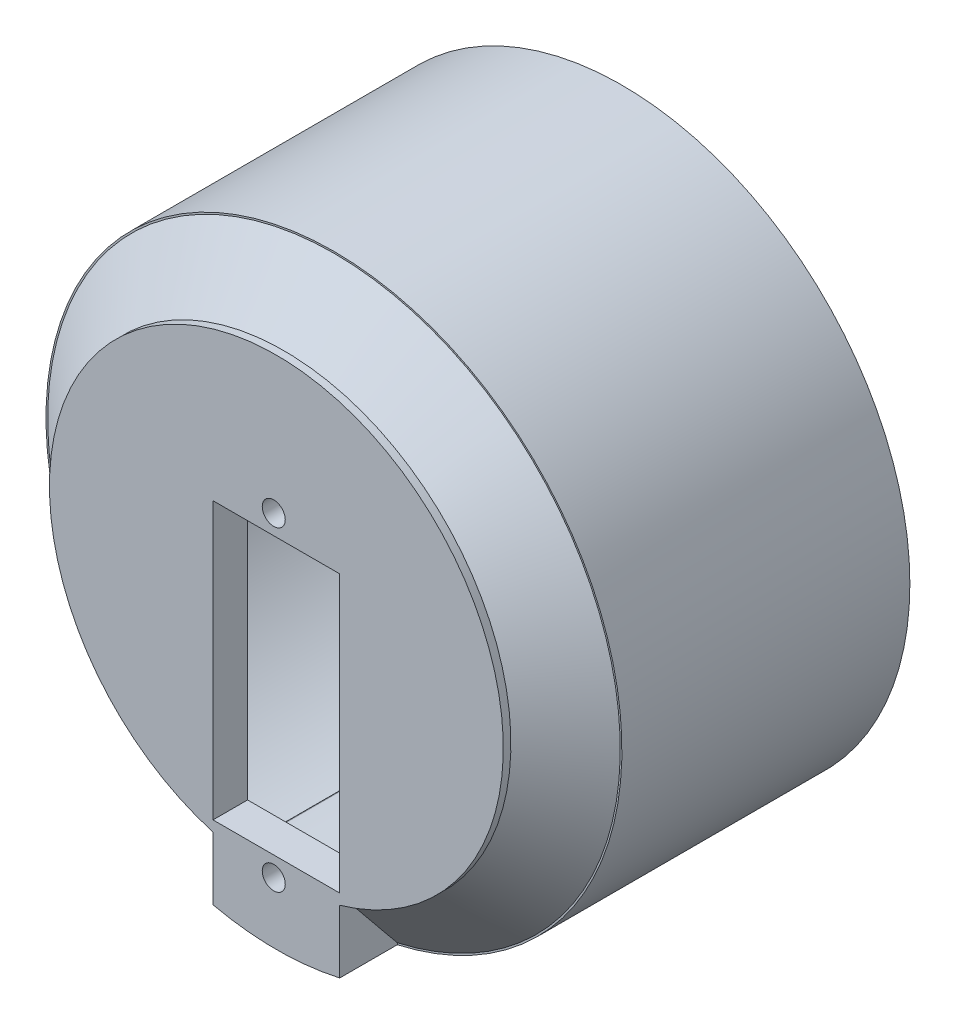
ISO-10303-21;
HEADER;
FILE_DESCRIPTION(('STEP AP214'),'2;1');
FILE_NAME('part.step','',(''),(''),'','','');
FILE_SCHEMA(('AUTOMOTIVE_DESIGN { 1 0 10303 214 1 1 1 1 }'));
ENDSEC;
DATA;
#1=APPLICATION_CONTEXT('core data for automotive mechanical design processes');
#2=APPLICATION_PROTOCOL_DEFINITION('international standard','automotive_design',2000,#1);
#3=PRODUCT_CONTEXT('',#1,'mechanical');
#4=PRODUCT('Part','Part','',(#3));
#5=PRODUCT_RELATED_PRODUCT_CATEGORY('part','',(#4));
#6=PRODUCT_DEFINITION_FORMATION('','',#4);
#7=PRODUCT_DEFINITION_CONTEXT('part definition',#1,'design');
#8=PRODUCT_DEFINITION('design','',#6,#7);
#9=PRODUCT_DEFINITION_SHAPE('','',#8);
#10=(LENGTH_UNIT() NAMED_UNIT(*) SI_UNIT(.MILLI.,.METRE.));
#11=(NAMED_UNIT(*) PLANE_ANGLE_UNIT() SI_UNIT($,.RADIAN.));
#12=(NAMED_UNIT(*) SI_UNIT($,.STERADIAN.) SOLID_ANGLE_UNIT());
#13=UNCERTAINTY_MEASURE_WITH_UNIT(LENGTH_MEASURE(1.E-05),#10,'distance_accuracy_value','');
#14=(GEOMETRIC_REPRESENTATION_CONTEXT(3) GLOBAL_UNCERTAINTY_ASSIGNED_CONTEXT((#13)) GLOBAL_UNIT_ASSIGNED_CONTEXT((#10,
#11,#12)) REPRESENTATION_CONTEXT('',''));
#15=CARTESIAN_POINT('',(0.,0.,0.));
#16=DIRECTION('',(0.,0.,1.));
#17=DIRECTION('',(1.,0.,0.));
#18=AXIS2_PLACEMENT_3D('',#15,#16,#17);
#19=CARTESIAN_POINT('',(0.,0.,25.));
#20=DIRECTION('',(0.,0.,-1.));
#21=DIRECTION('',(-1.,0.,0.));
#22=AXIS2_PLACEMENT_3D('',#19,#20,#21);
#23=CYLINDRICAL_SURFACE('',#22,22.);
#24=DIRECTION('',(0.,0.,1.));
#25=VECTOR('',#24,1.);
#26=CARTESIAN_POINT('',(5.44008097995109,-21.3167896018977,18.));
#27=LINE('',#26,#25);
#28=CARTESIAN_POINT('',(5.44008097995109,-21.3167896018977,18.));
#29=VERTEX_POINT('',#28);
#30=CARTESIAN_POINT('',(5.44008097995109,-21.3167896018977,27.));
#31=VERTEX_POINT('',#30);
#32=EDGE_CURVE('E224',#29,#31,#27,.T.);
#33=ORIENTED_EDGE('',*,*,#32,.F.);
#34=CARTESIAN_POINT('',(0.,0.,18.));
#35=DIRECTION('',(0.,0.,-1.));
#36=DIRECTION('',(-1.,0.,0.));
#37=AXIS2_PLACEMENT_3D('',#34,#35,#36);
#38=CIRCLE('',#37,22.);
#39=CARTESIAN_POINT('',(5.50000000000001,-21.3014084041408,18.));
#40=VERTEX_POINT('',#39);
#41=EDGE_CURVE('E76',#29,#40,#38,.F.);
#42=ORIENTED_EDGE('',*,*,#41,.T.);
#43=DIRECTION('',(0.,0.,-1.));
#44=VECTOR('',#43,1.);
#45=CARTESIAN_POINT('',(5.50000000000001,-21.3014084041408,25.));
#46=LINE('',#45,#44);
#47=CARTESIAN_POINT('',(5.50000000000001,-21.3014084041408,24.9874098905827));
#48=VERTEX_POINT('',#47);
#49=EDGE_CURVE('E269',#48,#40,#46,.T.);
#50=ORIENTED_EDGE('',*,*,#49,.F.);
#51=CARTESIAN_POINT('',(0.,0.,24.9874098905827));
#52=DIRECTION('',(0.,0.,-1.));
#53=DIRECTION('',(-1.,0.,0.));
#54=AXIS2_PLACEMENT_3D('',#51,#52,#53);
#55=CIRCLE('',#54,22.);
#56=CARTESIAN_POINT('',(-5.5,-21.3014084041408,24.9874098905827));
#57=VERTEX_POINT('',#56);
#58=EDGE_CURVE('E558',#57,#48,#55,.T.);
#59=ORIENTED_EDGE('',*,*,#58,.F.);
#60=DIRECTION('',(0.,0.,-1.));
#61=VECTOR('',#60,1.);
#62=CARTESIAN_POINT('',(-5.5,-21.3014084041408,25.));
#63=LINE('',#62,#61);
#64=CARTESIAN_POINT('',(-5.5,-21.3014084041408,18.));
#65=VERTEX_POINT('',#64);
#66=EDGE_CURVE('E259',#65,#57,#63,.F.);
#67=ORIENTED_EDGE('',*,*,#66,.F.);
#68=CARTESIAN_POINT('',(-5.44008097995109,-21.3167896018977,18.));
#69=VERTEX_POINT('',#68);
#70=EDGE_CURVE('E13',#65,#69,#38,.F.);
#71=ORIENTED_EDGE('',*,*,#70,.T.);
#72=DIRECTION('',(0.,0.,1.));
#73=VECTOR('',#72,1.);
#74=CARTESIAN_POINT('',(-5.44008097995109,-21.3167896018977,18.));
#75=LINE('',#74,#73);
#76=CARTESIAN_POINT('',(-5.44008097995109,-21.3167896018977,27.));
#77=VERTEX_POINT('',#76);
#78=EDGE_CURVE('E234',#69,#77,#75,.T.);
#79=ORIENTED_EDGE('',*,*,#78,.T.);
#80=CARTESIAN_POINT('',(0.,0.,27.));
#81=DIRECTION('',(0.,0.,-1.));
#82=DIRECTION('',(-1.,0.,0.));
#83=AXIS2_PLACEMENT_3D('',#80,#81,#82);
#84=CIRCLE('',#83,22.);
#85=EDGE_CURVE('E229',#31,#77,#84,.T.);
#86=ORIENTED_EDGE('',*,*,#85,.F.);
#87=EDGE_LOOP('',(#33,#42,#50,#59,#67,#71,#79,#86));
#88=FACE_BOUND('',#87,.T.);
#89=CARTESIAN_POINT('',(0.,0.,0.));
#90=DIRECTION('',(0.,0.,-1.));
#91=DIRECTION('',(-1.,0.,0.));
#92=AXIS2_PLACEMENT_3D('',#89,#90,#91);
#93=CIRCLE('',#92,22.);
#94=CARTESIAN_POINT('',(-22.,0.,0.));
#95=VERTEX_POINT('',#94);
#96=EDGE_CURVE('E466',#95,#95,#93,.T.);
#97=ORIENTED_EDGE('',*,*,#96,.T.);
#98=EDGE_LOOP('',(#97));
#99=FACE_BOUND('',#98,.T.);
#100=ADVANCED_FACE('F68',(#88,#99),#23,.F.);
#101=CARTESIAN_POINT('',(0.,0.,24.8786363184027));
#102=DIRECTION('',(0.,0.,-1.));
#103=DIRECTION('',(-1.,0.,0.));
#104=AXIS2_PLACEMENT_3D('',#101,#102,#103);
#105=CONICAL_SURFACE('',#104,25.,1.53455434546329);
#106=CARTESIAN_POINT('',(5.50000000000001,-14.6829865029652,25.2165853412473));
#107=CARTESIAN_POINT('',(5.50000000000001,-15.5122461025592,25.1884144601365));
#108=CARTESIAN_POINT('',(5.50000000000001,-16.3414966850203,25.1599803372252));
#109=CARTESIAN_POINT('',(5.50000000000001,-17.9999842225652,25.1027199385829));
#110=CARTESIAN_POINT('',(5.50000000000001,-18.8292211776506,25.0738936628984));
#111=CARTESIAN_POINT('',(5.50000000000001,-20.4876860034293,25.0159832848613));
#112=CARTESIAN_POINT('',(5.50000000000001,-21.3169138741232,24.9868991825277));
#113=CARTESIAN_POINT('',(5.50000000000001,-22.9753629471251,24.9285386726283));
#114=CARTESIAN_POINT('',(5.50000000000001,-23.8045841494322,24.8992622650403));
#115=CARTESIAN_POINT('',(5.50000000000001,-24.6338030989325,24.8699224699717));
#116=B_SPLINE_CURVE_WITH_KNOTS('',3,(#106,#107,#108,#109,#110,#111,#112,#113,#114,#115),
.UNSPECIFIED.,.F.,.F.,(4,2,2,2,4),(0.,2.48921373231164,4.97842716888889,7.46764042252315,
9.95685396476811),.UNSPECIFIED.);
#117=CARTESIAN_POINT('',(5.50000000000001,-20.9425905276891,25.));
#118=VERTEX_POINT('',#117);
#119=EDGE_CURVE('E261',#118,#48,#116,.T.);
#120=ORIENTED_EDGE('',*,*,#119,.F.);
#121=CARTESIAN_POINT('',(0.,0.,25.));
#122=DIRECTION('',(0.,0.,-1.));
#123=DIRECTION('',(-1.,0.,0.));
#124=AXIS2_PLACEMENT_3D('',#121,#122,#123);
#125=CIRCLE('',#124,21.6527619025946);
#126=CARTESIAN_POINT('',(-5.5,-20.9425905276891,25.));
#127=VERTEX_POINT('',#126);
#128=EDGE_CURVE('E340',#127,#118,#125,.T.);
#129=ORIENTED_EDGE('',*,*,#128,.F.);
#130=CARTESIAN_POINT('',(-5.5,-9.37859623119025,25.3908745161078));
#131=CARTESIAN_POINT('',(-5.5,-9.8315402006412,25.376701047878));
#132=CARTESIAN_POINT('',(-5.5,-10.2844763140847,25.3622800740103));
#133=CARTESIAN_POINT('',(-5.5,-11.1903359208793,25.3330504571022));
#134=CARTESIAN_POINT('',(-5.5,-11.6432594142339,25.3182418141699));
#135=CARTESIAN_POINT('',(-5.5,-13.0020153878447,25.2733954023074));
#136=CARTESIAN_POINT('',(-5.5,-13.9078339546625,25.2429371314737));
#137=CARTESIAN_POINT('',(-5.5,-15.7194476027846,25.1813562763794));
#138=CARTESIAN_POINT('',(-5.5,-16.6252426841087,25.1502336926945));
#139=CARTESIAN_POINT('',(-5.5,-18.4368182333387,25.0875613154027));
#140=CARTESIAN_POINT('',(-5.5,-19.3425987012416,25.0560115217099));
#141=CARTESIAN_POINT('',(-5.5,-21.2952993652556,24.9876863874938));
#142=CARTESIAN_POINT('',(-5.5,-22.3422178740088,24.9508628874686));
#143=CARTESIAN_POINT('',(-5.5,-24.4360458836645,24.8769603552005));
#144=CARTESIAN_POINT('',(-5.5,-25.4829553845667,24.8398813229528));
#145=CARTESIAN_POINT('',(-5.5,-27.5767689385705,24.7655450794539));
#146=CARTESIAN_POINT('',(-5.5,-28.6236729916667,24.7282878680527));
#147=CARTESIAN_POINT('',(-5.5,-30.7174763259439,24.6536409963876));
#148=CARTESIAN_POINT('',(-5.5,-31.7643756071253,24.6162513361301));
#149=CARTESIAN_POINT('',(-5.5,-32.8112733315299,24.578818299217));
#150=B_SPLINE_CURVE_WITH_KNOTS('',3,(#130,#131,#132,#133,#134,#135,#136,#137,#138,#139,#140,
#141,#142,#143,#144,#145,#146,#147,#148,#149),.UNSPECIFIED.,.F.,.F.,(4,2,2,2,2,2,2,2,2,4),(0.,
1.35949678857996,2.71899319817734,5.43798423743233,8.15697291992263,10.8759621482772,
14.0186598307858,17.1613575713456,20.3040579559416,23.446758187929),.UNSPECIFIED.);
#151=EDGE_CURVE('E323',#127,#57,#150,.T.);
#152=ORIENTED_EDGE('',*,*,#151,.T.);
#153=ORIENTED_EDGE('',*,*,#58,.T.);
#154=EDGE_LOOP('',(#120,#129,#152,#153));
#155=FACE_BOUND('',#154,.T.);
#156=ADVANCED_FACE('F271',(#155),#105,.F.);
#157=CARTESIAN_POINT('',(0.,0.,25.));
#158=DIRECTION('',(0.,0.,1.));
#159=DIRECTION('',(1.,0.,0.));
#160=AXIS2_PLACEMENT_3D('',#157,#158,#159);
#161=CYLINDRICAL_SURFACE('',#160,19.701313303964);
#162=DIRECTION('',(0.,0.,-1.));
#163=VECTOR('',#162,1.);
#164=CARTESIAN_POINT('',(-9.06144932155645,-17.4937669497971,27.));
#165=LINE('',#164,#163);
#166=CARTESIAN_POINT('',(-9.06144932155645,-17.4937669497971,27.));
#167=VERTEX_POINT('',#166);
#168=CARTESIAN_POINT('',(-9.06144932155645,-17.4937669497971,25.));
#169=VERTEX_POINT('',#168);
#170=EDGE_CURVE('E332',#167,#169,#165,.T.);
#171=ORIENTED_EDGE('',*,*,#170,.F.);
#172=CARTESIAN_POINT('',(0.,0.,27.));
#173=DIRECTION('',(0.,0.,-1.));
#174=DIRECTION('',(-1.,0.,0.));
#175=AXIS2_PLACEMENT_3D('',#172,#173,#174);
#176=CIRCLE('',#175,19.701313303964);
#177=CARTESIAN_POINT('',(-5.5,-18.9180270086748,27.));
#178=VERTEX_POINT('',#177);
#179=EDGE_CURVE('E384',#178,#167,#176,.T.);
#180=ORIENTED_EDGE('',*,*,#179,.F.);
#181=DIRECTION('',(0.,0.,1.));
#182=VECTOR('',#181,1.);
#183=CARTESIAN_POINT('',(-5.5,-18.9180270086748,25.));
#184=LINE('',#183,#182);
#185=CARTESIAN_POINT('',(-5.5,-18.9180270086748,28.5678935515272));
#186=VERTEX_POINT('',#185);
#187=EDGE_CURVE('E470',#178,#186,#184,.T.);
#188=ORIENTED_EDGE('',*,*,#187,.T.);
#189=CARTESIAN_POINT('',(0.,0.,28.5678935515272));
#190=DIRECTION('',(0.,0.,-1.));
#191=DIRECTION('',(-1.,0.,0.));
#192=AXIS2_PLACEMENT_3D('',#189,#190,#191);
#193=CIRCLE('',#192,19.701313303964);
#194=CARTESIAN_POINT('',(5.5,-18.9180270086748,28.5678935515272));
#195=VERTEX_POINT('',#194);
#196=EDGE_CURVE('E574',#186,#195,#193,.T.);
#197=ORIENTED_EDGE('',*,*,#196,.T.);
#198=DIRECTION('',(0.,0.,1.));
#199=VECTOR('',#198,1.);
#200=CARTESIAN_POINT('',(5.5,-18.9180270086748,25.));
#201=LINE('',#200,#199);
#202=CARTESIAN_POINT('',(5.5,-18.9180270086748,27.));
#203=VERTEX_POINT('',#202);
#204=EDGE_CURVE('E477',#203,#195,#201,.T.);
#205=ORIENTED_EDGE('',*,*,#204,.F.);
#206=CARTESIAN_POINT('',(9.06144932155645,-17.4937669497971,27.));
#207=VERTEX_POINT('',#206);
#208=EDGE_CURVE('E379',#207,#203,#176,.T.);
#209=ORIENTED_EDGE('',*,*,#208,.F.);
#210=DIRECTION('',(0.,0.,-1.));
#211=VECTOR('',#210,1.);
#212=CARTESIAN_POINT('',(9.06144932155645,-17.4937669497971,27.));
#213=LINE('',#212,#211);
#214=CARTESIAN_POINT('',(9.06144932155645,-17.4937669497971,25.));
#215=VERTEX_POINT('',#214);
#216=EDGE_CURVE('E342',#207,#215,#213,.T.);
#217=ORIENTED_EDGE('',*,*,#216,.T.);
#218=CARTESIAN_POINT('',(0.,0.,25.));
#219=DIRECTION('',(0.,0.,1.));
#220=DIRECTION('',(1.,0.,0.));
#221=AXIS2_PLACEMENT_3D('',#218,#219,#220);
#222=CIRCLE('',#221,19.701313303964);
#223=EDGE_CURVE('E453',#215,#169,#222,.T.);
#224=ORIENTED_EDGE('',*,*,#223,.T.);
#225=EDGE_LOOP('',(#171,#180,#188,#197,#205,#209,#217,#224));
#226=FACE_BOUND('',#225,.T.);
#227=ADVANCED_FACE('F530',(#226),#161,.T.);
#228=CARTESIAN_POINT('',(-5.5,0.,25.));
#229=DIRECTION('',(-1.,0.,0.));
#230=DIRECTION('',(0.,0.,1.));
#231=AXIS2_PLACEMENT_3D('',#228,#229,#230);
#232=PLANE('',#231);
#233=ORIENTED_EDGE('',*,*,#187,.F.);
#234=DIRECTION('',(0.,1.,0.));
#235=VECTOR('',#234,1.);
#236=CARTESIAN_POINT('',(-5.5,0.,27.));
#237=LINE('',#236,#235);
#238=CARTESIAN_POINT('',(-5.5,-19.809519206206,27.));
#239=VERTEX_POINT('',#238);
#240=EDGE_CURVE('E389',#239,#178,#237,.T.);
#241=ORIENTED_EDGE('',*,*,#240,.F.);
#242=CARTESIAN_POINT('',(-5.5,-14.2260768253443,36.7022450638078));
#243=CARTESIAN_POINT('',(-5.5,-14.4493178306684,36.3215406891056));
#244=CARTESIAN_POINT('',(-5.5,-14.672056617973,35.9405423025907));
#245=CARTESIAN_POINT('',(-5.5,-15.1166408997499,35.1780253386219));
#246=CARTESIAN_POINT('',(-5.5,-15.3384863954471,34.7965067618824));
#247=CARTESIAN_POINT('',(-5.5,-16.0028479100555,33.6512755223987));
#248=CARTESIAN_POINT('',(-5.5,-16.4441916411825,32.8868827658367));
#249=CARTESIAN_POINT('',(-5.5,-17.3244052833301,31.3566967639084));
#250=CARTESIAN_POINT('',(-5.5,-17.7632752460372,30.5909035482492));
#251=CARTESIAN_POINT('',(-5.5,-18.6390287715927,29.0581808524109));
#252=CARTESIAN_POINT('',(-5.5,-19.075912331013,28.2912513702739));
#253=CARTESIAN_POINT('',(-5.5,-20.3841372517835,25.9891171502764));
#254=CARTESIAN_POINT('',(-5.5,-21.2530670014334,24.452541986987));
#255=CARTESIAN_POINT('',(-5.5,-22.5531417802179,22.1457896967271));
#256=CARTESIAN_POINT('',(-5.5,-22.9859513506115,21.3765490923014));
#257=CARTESIAN_POINT('',(-5.5,-23.8506161101238,19.8375319614718));
#258=CARTESIAN_POINT('',(-5.5,-24.2824712995437,19.0677554352374));
#259=CARTESIAN_POINT('',(-5.5,-24.7139271232146,18.2977549361922));
#260=B_SPLINE_CURVE_WITH_KNOTS('',3,(#242,#243,#244,#245,#246,#247,#248,#249,#250,#251,#252,
#253,#254,#255,#256,#257,#258,#259),.UNSPECIFIED.,.F.,.F.,(4,2,2,2,2,2,2,2,4),(0.,
1.32398964579704,2.64797747528611,5.29593719603219,7.94384138404397,10.5917501399703,
15.8874823862485,18.5354052383518,21.1833272543564),.UNSPECIFIED.);
#261=EDGE_CURVE('E331',#186,#239,#260,.T.);
#262=ORIENTED_EDGE('',*,*,#261,.F.);
#263=EDGE_LOOP('',(#233,#241,#262));
#264=FACE_BOUND('',#263,.T.);
#265=ADVANCED_FACE('F538',(#264),#232,.T.);
#266=CARTESIAN_POINT('',(5.5,0.,25.));
#267=DIRECTION('',(-1.,0.,0.));
#268=DIRECTION('',(0.,-1.,0.));
#269=AXIS2_PLACEMENT_3D('',#266,#267,#268);
#270=PLANE('',#269);
#271=DIRECTION('',(0.,-1.,0.));
#272=VECTOR('',#271,1.);
#273=CARTESIAN_POINT('',(5.5,0.,27.));
#274=LINE('',#273,#272);
#275=CARTESIAN_POINT('',(5.5,-19.809519206206,27.));
#276=VERTEX_POINT('',#275);
#277=EDGE_CURVE('E386',#203,#276,#274,.T.);
#278=ORIENTED_EDGE('',*,*,#277,.F.);
#279=ORIENTED_EDGE('',*,*,#204,.T.);
#280=CARTESIAN_POINT('',(5.5,-24.1515932295979,19.3007847394464));
#281=CARTESIAN_POINT('',(5.5,-23.7669010261033,19.9865671448865));
#282=CARTESIAN_POINT('',(5.5,-23.3818688331949,20.6721586989083));
#283=CARTESIAN_POINT('',(5.5,-22.6110057064612,22.0428929100748));
#284=CARTESIAN_POINT('',(5.5,-22.2251747723497,22.7280355670586));
#285=CARTESIAN_POINT('',(5.5,-21.0663188895503,24.7826660396843));
#286=CARTESIAN_POINT('',(5.5,-20.2919181604128,26.1513790154122));
#287=CARTESIAN_POINT('',(5.5,-19.1264788377258,28.2022772298326));
#288=CARTESIAN_POINT('',(5.5,-18.7373571993935,28.8855518600639));
#289=CARTESIAN_POINT('',(5.5,-17.9575709966463,30.2512194113319));
#290=CARTESIAN_POINT('',(5.5,-17.5669064338984,30.9336123333202));
#291=CARTESIAN_POINT('',(5.5,-16.7837127674561,32.297342628982));
#292=CARTESIAN_POINT('',(5.5,-16.3911836340131,32.9786799855827));
#293=CARTESIAN_POINT('',(5.5,-15.6038097619982,34.3400184997517));
#294=CARTESIAN_POINT('',(5.5,-15.2089650146293,35.0200196522306));
#295=CARTESIAN_POINT('',(5.5,-14.8127353130996,35.6992152605535));
#296=B_SPLINE_CURVE_WITH_KNOTS('',3,(#280,#281,#282,#283,#284,#285,#286,#287,#288,#289,#290,
#291,#292,#293,#294,#295),.UNSPECIFIED.,.F.,.F.,(4,2,2,2,2,2,2,4),(0.,2.35893374962126,
4.71786834487805,9.43565961099211,11.794581295471,14.1535004319733,16.5124573314685,
18.8714231984059),.UNSPECIFIED.);
#297=EDGE_CURVE('E330',#276,#195,#296,.T.);
#298=ORIENTED_EDGE('',*,*,#297,.F.);
#299=EDGE_LOOP('',(#278,#279,#298));
#300=FACE_BOUND('',#299,.T.);
#301=ADVANCED_FACE('F542',(#300),#270,.F.);
#302=CARTESIAN_POINT('',(-5.5,6.,30.));
#303=DIRECTION('',(1.,0.,0.));
#304=DIRECTION('',(0.,1.,0.));
#305=AXIS2_PLACEMENT_3D('',#302,#303,#304);
#306=PLANE('',#305);
#307=DIRECTION('',(0.,0.,-1.));
#308=VECTOR('',#307,1.);
#309=CARTESIAN_POINT('',(-5.5,-18.,30.));
#310=LINE('',#309,#308);
#311=CARTESIAN_POINT('',(-5.5,-18.,30.));
#312=VERTEX_POINT('',#311);
#313=CARTESIAN_POINT('',(-5.5,-18.,27.));
#314=VERTEX_POINT('',#313);
#315=EDGE_CURVE('E421',#312,#314,#310,.T.);
#316=ORIENTED_EDGE('',*,*,#315,.T.);
#317=DIRECTION('',(0.,-1.,0.));
#318=VECTOR('',#317,1.);
#319=CARTESIAN_POINT('',(-5.5,0.,27.));
#320=LINE('',#319,#318);
#321=CARTESIAN_POINT('',(-5.5,6.,27.));
#322=VERTEX_POINT('',#321);
#323=EDGE_CURVE('E401',#322,#314,#320,.T.);
#324=ORIENTED_EDGE('',*,*,#323,.F.);
#325=DIRECTION('',(0.,0.,-1.));
#326=VECTOR('',#325,1.);
#327=CARTESIAN_POINT('',(-5.5,6.,30.));
#328=LINE('',#327,#326);
#329=CARTESIAN_POINT('',(-5.5,6.,30.));
#330=VERTEX_POINT('',#329);
#331=EDGE_CURVE('E425',#330,#322,#328,.T.);
#332=ORIENTED_EDGE('',*,*,#331,.F.);
#333=DIRECTION('',(0.,-1.,0.));
#334=VECTOR('',#333,1.);
#335=CARTESIAN_POINT('',(-5.5,6.,30.));
#336=LINE('',#335,#334);
#337=EDGE_CURVE('E484',#330,#312,#336,.T.);
#338=ORIENTED_EDGE('',*,*,#337,.T.);
#339=EDGE_LOOP('',(#316,#324,#332,#338));
#340=FACE_BOUND('',#339,.T.);
#341=ADVANCED_FACE('F497',(#340),#306,.T.);
#342=CARTESIAN_POINT('',(-5.5,-18.,30.));
#343=DIRECTION('',(0.,1.,0.));
#344=DIRECTION('',(0.,0.,1.));
#345=AXIS2_PLACEMENT_3D('',#342,#343,#344);
#346=PLANE('',#345);
#347=DIRECTION('',(0.,0.,-1.));
#348=VECTOR('',#347,1.);
#349=CARTESIAN_POINT('',(5.50000000000001,-18.,30.));
#350=LINE('',#349,#348);
#351=CARTESIAN_POINT('',(5.50000000000001,-18.,30.));
#352=VERTEX_POINT('',#351);
#353=CARTESIAN_POINT('',(5.50000000000001,-18.,27.));
#354=VERTEX_POINT('',#353);
#355=EDGE_CURVE('E415',#352,#354,#350,.T.);
#356=ORIENTED_EDGE('',*,*,#355,.T.);
#357=DIRECTION('',(1.,0.,0.));
#358=VECTOR('',#357,1.);
#359=CARTESIAN_POINT('',(0.,-18.,27.));
#360=LINE('',#359,#358);
#361=EDGE_CURVE('E403',#314,#354,#360,.T.);
#362=ORIENTED_EDGE('',*,*,#361,.F.);
#363=ORIENTED_EDGE('',*,*,#315,.F.);
#364=DIRECTION('',(1.,0.,0.));
#365=VECTOR('',#364,1.);
#366=CARTESIAN_POINT('',(-5.5,-18.,30.));
#367=LINE('',#366,#365);
#368=EDGE_CURVE('E420',#312,#352,#367,.T.);
#369=ORIENTED_EDGE('',*,*,#368,.T.);
#370=EDGE_LOOP('',(#356,#362,#363,#369));
#371=FACE_BOUND('',#370,.T.);
#372=ADVANCED_FACE('F418',(#371),#346,.T.);
#373=CARTESIAN_POINT('',(5.5,6.,30.));
#374=DIRECTION('',(-1.,0.,0.));
#375=DIRECTION('',(0.,-1.,0.));
#376=AXIS2_PLACEMENT_3D('',#373,#374,#375);
#377=PLANE('',#376);
#378=DIRECTION('',(0.,0.,-1.));
#379=VECTOR('',#378,1.);
#380=CARTESIAN_POINT('',(5.5,6.,30.));
#381=LINE('',#380,#379);
#382=CARTESIAN_POINT('',(5.5,6.,30.));
#383=VERTEX_POINT('',#382);
#384=CARTESIAN_POINT('',(5.5,6.,27.));
#385=VERTEX_POINT('',#384);
#386=EDGE_CURVE('E417',#383,#385,#381,.T.);
#387=ORIENTED_EDGE('',*,*,#386,.T.);
#388=DIRECTION('',(0.,1.,0.));
#389=VECTOR('',#388,1.);
#390=CARTESIAN_POINT('',(5.5,0.,27.));
#391=LINE('',#390,#389);
#392=EDGE_CURVE('E91',#354,#385,#391,.T.);
#393=ORIENTED_EDGE('',*,*,#392,.F.);
#394=ORIENTED_EDGE('',*,*,#355,.F.);
#395=DIRECTION('',(0.,1.,0.));
#396=VECTOR('',#395,1.);
#397=CARTESIAN_POINT('',(5.5,6.,30.));
#398=LINE('',#397,#396);
#399=EDGE_CURVE('E487',#352,#383,#398,.T.);
#400=ORIENTED_EDGE('',*,*,#399,.T.);
#401=EDGE_LOOP('',(#387,#393,#394,#400));
#402=FACE_BOUND('',#401,.T.);
#403=ADVANCED_FACE('F413',(#402),#377,.T.);
#404=CARTESIAN_POINT('',(-5.5,6.,30.));
#405=DIRECTION('',(0.,-1.,0.));
#406=DIRECTION('',(0.,0.,-1.));
#407=AXIS2_PLACEMENT_3D('',#404,#405,#406);
#408=PLANE('',#407);
#409=ORIENTED_EDGE('',*,*,#331,.T.);
#410=DIRECTION('',(-1.,0.,0.));
#411=VECTOR('',#410,1.);
#412=CARTESIAN_POINT('',(0.,6.,27.));
#413=LINE('',#412,#411);
#414=EDGE_CURVE('E365',#385,#322,#413,.T.);
#415=ORIENTED_EDGE('',*,*,#414,.F.);
#416=ORIENTED_EDGE('',*,*,#386,.F.);
#417=DIRECTION('',(-1.,0.,0.));
#418=VECTOR('',#417,1.);
#419=CARTESIAN_POINT('',(-5.5,6.,30.));
#420=LINE('',#419,#418);
#421=EDGE_CURVE('E489',#383,#330,#420,.T.);
#422=ORIENTED_EDGE('',*,*,#421,.T.);
#423=EDGE_LOOP('',(#409,#415,#416,#422));
#424=FACE_BOUND('',#423,.T.);
#425=ADVANCED_FACE('F493',(#424),#408,.T.);
#426=CARTESIAN_POINT('',(-0.227477253695701,7.7,30.));
#427=DIRECTION('',(0.,0.,-1.));
#428=DIRECTION('',(-1.,0.,0.));
#429=AXIS2_PLACEMENT_3D('',#426,#427,#428);
#430=CYLINDRICAL_SURFACE('',#429,1.);
#431=CARTESIAN_POINT('',(-0.227477253695701,7.7,30.));
#432=DIRECTION('',(0.,0.,1.));
#433=DIRECTION('',(1.,0.,0.));
#434=AXIS2_PLACEMENT_3D('',#431,#432,#433);
#435=CIRCLE('',#434,1.);
#436=CARTESIAN_POINT('',(0.772522746304299,7.7,30.));
#437=VERTEX_POINT('',#436);
#438=EDGE_CURVE('E481',#437,#437,#435,.T.);
#439=ORIENTED_EDGE('',*,*,#438,.T.);
#440=EDGE_LOOP('',(#439));
#441=FACE_BOUND('',#440,.T.);
#442=CARTESIAN_POINT('',(-0.227477253695701,7.7,27.));
#443=DIRECTION('',(0.,0.,-1.));
#444=DIRECTION('',(-1.,0.,0.));
#445=AXIS2_PLACEMENT_3D('',#442,#443,#444);
#446=CIRCLE('',#445,1.);
#447=CARTESIAN_POINT('',(-1.2274772536957,7.7,27.));
#448=VERTEX_POINT('',#447);
#449=EDGE_CURVE('E361',#448,#448,#446,.F.);
#450=ORIENTED_EDGE('',*,*,#449,.F.);
#451=EDGE_LOOP('',(#450));
#452=FACE_BOUND('',#451,.T.);
#453=ADVANCED_FACE('F595',(#441,#452),#430,.F.);
#454=CARTESIAN_POINT('',(-0.227477253695698,-19.7,30.));
#455=DIRECTION('',(0.,0.,-1.));
#456=DIRECTION('',(-1.,0.,0.));
#457=AXIS2_PLACEMENT_3D('',#454,#455,#456);
#458=CYLINDRICAL_SURFACE('',#457,1.);
#459=CARTESIAN_POINT('',(-0.227477253695698,-19.7,30.));
#460=DIRECTION('',(0.,0.,1.));
#461=DIRECTION('',(1.,0.,0.));
#462=AXIS2_PLACEMENT_3D('',#459,#460,#461);
#463=CIRCLE('',#462,1.);
#464=CARTESIAN_POINT('',(0.772522746304303,-19.7,30.));
#465=VERTEX_POINT('',#464);
#466=EDGE_CURVE('E472',#465,#465,#463,.T.);
#467=ORIENTED_EDGE('',*,*,#466,.T.);
#468=EDGE_LOOP('',(#467));
#469=FACE_BOUND('',#468,.T.);
#470=CARTESIAN_POINT('',(-0.227477253695698,-19.7,27.));
#471=DIRECTION('',(0.,0.,-1.));
#472=DIRECTION('',(-1.,0.,0.));
#473=AXIS2_PLACEMENT_3D('',#470,#471,#472);
#474=CIRCLE('',#473,1.);
#475=CARTESIAN_POINT('',(-1.2274772536957,-19.7,27.));
#476=VERTEX_POINT('',#475);
#477=EDGE_CURVE('E377',#476,#476,#474,.F.);
#478=ORIENTED_EDGE('',*,*,#477,.F.);
#479=EDGE_LOOP('',(#478));
#480=FACE_BOUND('',#479,.T.);
#481=ADVANCED_FACE('F590',(#469,#480),#458,.F.);
#482=CARTESIAN_POINT('',(0.,0.,25.));
#483=DIRECTION('',(0.,0.,-1.));
#484=DIRECTION('',(-1.,0.,0.));
#485=AXIS2_PLACEMENT_3D('',#482,#483,#484);
#486=PLANE('',#485);
#487=ORIENTED_EDGE('',*,*,#223,.F.);
#488=DIRECTION('',(0.,1.,0.));
#489=VECTOR('',#488,1.);
#490=CARTESIAN_POINT('',(9.06144932155645,0.,25.));
#491=LINE('',#490,#489);
#492=CARTESIAN_POINT('',(9.06144932155645,9.50721702610733,25.));
#493=VERTEX_POINT('',#492);
#494=EDGE_CURVE('E357',#215,#493,#491,.T.);
#495=ORIENTED_EDGE('',*,*,#494,.T.);
#496=DIRECTION('',(-1.,0.,0.));
#497=VECTOR('',#496,1.);
#498=CARTESIAN_POINT('',(0.,9.50721702610733,25.));
#499=LINE('',#498,#497);
#500=CARTESIAN_POINT('',(-9.06144932155645,9.50721702610733,25.));
#501=VERTEX_POINT('',#500);
#502=EDGE_CURVE('E373',#493,#501,#499,.T.);
#503=ORIENTED_EDGE('',*,*,#502,.T.);
#504=DIRECTION('',(0.,1.,0.));
#505=VECTOR('',#504,1.);
#506=CARTESIAN_POINT('',(-9.06144932155645,0.,25.));
#507=LINE('',#506,#505);
#508=EDGE_CURVE('E372',#169,#501,#507,.T.);
#509=ORIENTED_EDGE('',*,*,#508,.F.);
#510=EDGE_LOOP('',(#487,#495,#503,#509));
#511=FACE_BOUND('',#510,.T.);
#512=ADVANCED_FACE('F533',(#511),#486,.T.);
#513=CARTESIAN_POINT('',(5.5,-18.9180270086748,29.3404288393407));
#514=VERTEX_POINT('',#513);
#515=CARTESIAN_POINT('',(5.5,-18.9180270086748,30.));
#516=VERTEX_POINT('',#515);
#517=EDGE_CURVE('E461',#514,#516,#201,.T.);
#518=ORIENTED_EDGE('',*,*,#517,.F.);
#519=CARTESIAN_POINT('',(0.,0.,29.3404288393407));
#520=DIRECTION('',(0.,0.,-1.));
#521=DIRECTION('',(-1.,0.,0.));
#522=AXIS2_PLACEMENT_3D('',#519,#520,#521);
#523=CIRCLE('',#522,19.701313303964);
#524=CARTESIAN_POINT('',(-5.5,-18.9180270086748,29.3404288393407));
#525=VERTEX_POINT('',#524);
#526=EDGE_CURVE('E514',#514,#525,#523,.F.);
#527=ORIENTED_EDGE('',*,*,#526,.T.);
#528=CARTESIAN_POINT('',(-5.5,-18.9180270086748,30.));
#529=VERTEX_POINT('',#528);
#530=EDGE_CURVE('E473',#525,#529,#184,.T.);
#531=ORIENTED_EDGE('',*,*,#530,.T.);
#532=CARTESIAN_POINT('',(0.,0.,30.));
#533=DIRECTION('',(0.,0.,1.));
#534=DIRECTION('',(1.,0.,0.));
#535=AXIS2_PLACEMENT_3D('',#532,#533,#534);
#536=CIRCLE('',#535,19.701313303964);
#537=EDGE_CURVE('E462',#516,#529,#536,.T.);
#538=ORIENTED_EDGE('',*,*,#537,.F.);
#539=EDGE_LOOP('',(#518,#527,#531,#538));
#540=FACE_BOUND('',#539,.T.);
#541=ADVANCED_FACE('F511',(#540),#161,.T.);
#542=ORIENTED_EDGE('',*,*,#530,.F.);
#543=CARTESIAN_POINT('',(-5.5,-34.3397130176316,16.64553514238));
#544=CARTESIAN_POINT('',(-5.5,-33.7960056003316,17.097603935747));
#545=CARTESIAN_POINT('',(-5.5,-33.2521681632569,17.5495163297719));
#546=CARTESIAN_POINT('',(-5.5,-32.1641878750666,18.4529734597862));
#547=CARTESIAN_POINT('',(-5.5,-31.6200450239107,18.9045181957267));
#548=CARTESIAN_POINT('',(-5.5,-29.9871295092889,20.2584861054101));
#549=CARTESIAN_POINT('',(-5.5,-28.8978309294136,21.1602753838626));
#550=CARTESIAN_POINT('',(-5.5,-26.717539170032,22.9613138863923));
#551=CARTESIAN_POINT('',(-5.5,-25.6265464167496,23.8605636263148));
#552=CARTESIAN_POINT('',(-5.5,-23.4417584827982,25.6557406697232));
#553=CARTESIAN_POINT('',(-5.5,-22.3479631981773,26.5516678468606));
#554=CARTESIAN_POINT('',(-5.5,-20.7039317790233,27.8918654382025));
#555=CARTESIAN_POINT('',(-5.5,-20.1552662064901,28.3380621184797));
#556=CARTESIAN_POINT('',(-5.5,-19.0566074609594,29.2288132371445));
#557=CARTESIAN_POINT('',(-5.5,-18.506614294683,29.6733676838174));
#558=CARTESIAN_POINT('',(-5.5,-17.4049814289751,30.5603284138007));
#559=CARTESIAN_POINT('',(-5.5,-16.8533418866599,31.0027348921379));
#560=CARTESIAN_POINT('',(-5.5,-15.7478356033156,31.8847813079484));
#561=CARTESIAN_POINT('',(-5.5,-15.193968819861,32.3244211923093));
#562=CARTESIAN_POINT('',(-5.5,-14.0830759935893,33.2000901066982));
#563=CARTESIAN_POINT('',(-5.5,-13.5260489281309,33.6361178405971));
#564=CARTESIAN_POINT('',(-5.5,-12.4079407751966,34.502901266942));
#565=CARTESIAN_POINT('',(-5.5,-11.8468599038463,34.9336572371977));
#566=CARTESIAN_POINT('',(-5.5,-11.0007573286729,35.5740675046558));
#567=CARTESIAN_POINT('',(-5.5,-10.7179289317509,35.7866184579183));
#568=CARTESIAN_POINT('',(-5.5,-10.1504857395148,36.2093141404703));
#569=CARTESIAN_POINT('',(-5.5,-9.86587097676355,36.4194589134248));
#570=CARTESIAN_POINT('',(-5.5,-9.29439677246642,36.8367890442433));
#571=CARTESIAN_POINT('',(-5.5,-9.00753693943823,37.0439738673322));
#572=CARTESIAN_POINT('',(-5.5,-8.57519491615579,37.3518881075386));
#573=CARTESIAN_POINT('',(-5.5,-8.43073428070444,37.4540521944072));
#574=CARTESIAN_POINT('',(-5.5,-8.14104356947603,37.6572875653603));
#575=CARTESIAN_POINT('',(-5.5,-7.99581348296459,37.7583588341392));
#576=CARTESIAN_POINT('',(-5.5,-7.85015654508854,37.8588141641508));
#577=B_SPLINE_CURVE_WITH_KNOTS('',3,(#543,#544,#545,#546,#547,#548,#549,#550,#551,#552,#553,
#554,#555,#556,#557,#558,#559,#560,#561,#562,#563,#564,#565,#566,#567,#568,#569,#570,#571,#572,
#573,#574,#575,#576),.UNSPECIFIED.,.F.,.F.,(4,2,2,2,2,2,2,2,2,2,2,2,2,2,2,2,4),(0.,
2.12128621010805,4.24257270134818,8.48499367373235,12.7264799672692,16.9681259327245,
19.0897099203682,21.2112831897103,23.3326600848249,25.4540775821553,27.576225915079,
29.6982619300247,30.7596324117598,31.8209836021525,32.8825241821284,33.4133279081839,
33.9441390589317),.UNSPECIFIED.);
#578=CARTESIAN_POINT('',(-5.5,-24.239727416343,25.));
#579=VERTEX_POINT('',#578);
#580=EDGE_CURVE('E314',#579,#525,#577,.T.);
#581=ORIENTED_EDGE('',*,*,#580,.F.);
#582=DIRECTION('',(0.,-1.,0.));
#583=VECTOR('',#582,1.);
#584=CARTESIAN_POINT('',(-5.5,0.,25.));
#585=LINE('',#584,#583);
#586=CARTESIAN_POINT('',(-5.5,-24.3874967965144,25.));
#587=VERTEX_POINT('',#586);
#588=EDGE_CURVE('E441',#579,#587,#585,.T.);
#589=ORIENTED_EDGE('',*,*,#588,.T.);
#590=DIRECTION('',(0.,0.,1.));
#591=VECTOR('',#590,1.);
#592=CARTESIAN_POINT('',(-5.5,-24.3874967965144,25.));
#593=LINE('',#592,#591);
#594=CARTESIAN_POINT('',(-5.5,-24.3874967965144,30.));
#595=VERTEX_POINT('',#594);
#596=EDGE_CURVE('E474',#587,#595,#593,.T.);
#597=ORIENTED_EDGE('',*,*,#596,.T.);
#598=DIRECTION('',(0.,-1.,0.));
#599=VECTOR('',#598,1.);
#600=CARTESIAN_POINT('',(-5.5,0.,30.));
#601=LINE('',#600,#599);
#602=EDGE_CURVE('E456',#529,#595,#601,.T.);
#603=ORIENTED_EDGE('',*,*,#602,.F.);
#604=EDGE_LOOP('',(#542,#581,#589,#597,#603));
#605=FACE_BOUND('',#604,.T.);
#606=ADVANCED_FACE('F516',(#605),#232,.T.);
#607=CARTESIAN_POINT('',(5.5,-11.5073547052322,35.1903027529584));
#608=CARTESIAN_POINT('',(5.5,-11.7472136036351,35.008063916936));
#609=CARTESIAN_POINT('',(5.5,-11.9865700513604,34.8251660116741));
#610=CARTESIAN_POINT('',(5.5,-12.4644045644161,34.4582292381845));
#611=CARTESIAN_POINT('',(5.5,-12.7028826353732,34.2741903772859));
#612=CARTESIAN_POINT('',(5.5,-13.4171816772199,33.7206338889917));
#613=CARTESIAN_POINT('',(5.5,-13.8918795409424,33.3496671626562));
#614=CARTESIAN_POINT('',(5.5,-14.8389766778563,32.6048749167278));
#615=CARTESIAN_POINT('',(5.5,-15.3113760891252,32.231049572422));
#616=CARTESIAN_POINT('',(5.5,-16.2544167257168,31.4811819754804));
#617=CARTESIAN_POINT('',(5.5,-16.7250579380593,31.1051397065304));
#618=CARTESIAN_POINT('',(5.5,-17.6649062471756,30.35135532667));
#619=CARTESIAN_POINT('',(5.5,-18.1341134699322,29.9736133727408));
#620=CARTESIAN_POINT('',(5.5,-19.0714065119932,29.2167438571276));
#621=CARTESIAN_POINT('',(5.5,-19.5394923341792,28.8376162990104));
#622=CARTESIAN_POINT('',(5.5,-20.9424095877064,27.6985494695697));
#623=CARTESIAN_POINT('',(5.5,-21.8758842789317,26.9369393318131));
#624=CARTESIAN_POINT('',(5.5,-23.5596410580352,25.5586148915325));
#625=CARTESIAN_POINT('',(5.5,-24.3103581672524,24.9424312719437));
#626=CARTESIAN_POINT('',(5.5,-25.8105442301712,23.7085577514053));
#627=CARTESIAN_POINT('',(5.5,-26.5600131929989,23.0908678615512));
#628=CARTESIAN_POINT('',(5.5,-28.0580323304039,21.8542821987341));
#629=CARTESIAN_POINT('',(5.5,-28.8065824459675,21.2353863543105));
#630=CARTESIAN_POINT('',(5.5,-30.3029098324223,19.9966512812747));
#631=CARTESIAN_POINT('',(5.5,-31.0506870983453,19.3768120466605));
#632=CARTESIAN_POINT('',(5.5,-31.798169099957,18.7566174821003));
#633=B_SPLINE_CURVE_WITH_KNOTS('',3,(#607,#608,#609,#610,#611,#612,#613,#614,#615,#616,#617,
#618,#619,#620,#621,#622,#623,#624,#625,#626,#627,#628,#629,#630,#631,#632),.UNSPECIFIED.,.F.,
.F.,(4,2,2,2,2,2,2,2,2,2,2,2,4),(0.,0.90370557615532,1.80740535324446,3.61475940638279,
5.4220035094753,7.22926092868509,9.03635472403327,10.8434438709712,14.4576857848125,
17.3713287746813,20.2849503667081,23.1987502055655,26.1125686607082),.UNSPECIFIED.);
#634=CARTESIAN_POINT('',(5.5,-24.239727416343,25.));
#635=VERTEX_POINT('',#634);
#636=EDGE_CURVE('E447',#514,#635,#633,.T.);
#637=ORIENTED_EDGE('',*,*,#636,.F.);
#638=ORIENTED_EDGE('',*,*,#517,.T.);
#639=DIRECTION('',(0.,-1.,0.));
#640=VECTOR('',#639,1.);
#641=CARTESIAN_POINT('',(5.5,0.,30.));
#642=LINE('',#641,#640);
#643=CARTESIAN_POINT('',(5.5,-24.3874967965144,30.));
#644=VERTEX_POINT('',#643);
#645=EDGE_CURVE('E465',#516,#644,#642,.T.);
#646=ORIENTED_EDGE('',*,*,#645,.T.);
#647=DIRECTION('',(0.,0.,1.));
#648=VECTOR('',#647,1.);
#649=CARTESIAN_POINT('',(5.5,-24.3874967965144,25.));
#650=LINE('',#649,#648);
#651=CARTESIAN_POINT('',(5.5,-24.3874967965144,25.));
#652=VERTEX_POINT('',#651);
#653=EDGE_CURVE('E450',#652,#644,#650,.T.);
#654=ORIENTED_EDGE('',*,*,#653,.F.);
#655=DIRECTION('',(0.,-1.,0.));
#656=VECTOR('',#655,1.);
#657=CARTESIAN_POINT('',(5.5,0.,25.));
#658=LINE('',#657,#656);
#659=EDGE_CURVE('E439',#635,#652,#658,.T.);
#660=ORIENTED_EDGE('',*,*,#659,.F.);
#661=EDGE_LOOP('',(#637,#638,#646,#654,#660));
#662=FACE_BOUND('',#661,.T.);
#663=ADVANCED_FACE('F446',(#662),#270,.F.);
#664=CARTESIAN_POINT('',(0.,0.,25.));
#665=DIRECTION('',(0.,0.,1.));
#666=DIRECTION('',(1.,0.,0.));
#667=AXIS2_PLACEMENT_3D('',#664,#665,#666);
#668=PLANE('',#667);
#669=ORIENTED_EDGE('',*,*,#588,.F.);
#670=CARTESIAN_POINT('',(0.,0.,25.));
#671=DIRECTION('',(0.,0.,1.));
#672=DIRECTION('',(1.,0.,0.));
#673=AXIS2_PLACEMENT_3D('',#670,#671,#672);
#674=CIRCLE('',#673,24.8558722481954);
#675=EDGE_CURVE('E242',#579,#635,#674,.F.);
#676=ORIENTED_EDGE('',*,*,#675,.T.);
#677=ORIENTED_EDGE('',*,*,#659,.T.);
#678=CARTESIAN_POINT('',(0.,0.,25.));
#679=DIRECTION('',(0.,0.,1.));
#680=DIRECTION('',(1.,0.,0.));
#681=AXIS2_PLACEMENT_3D('',#678,#679,#680);
#682=CIRCLE('',#681,25.);
#683=EDGE_CURVE('E452',#652,#587,#682,.T.);
#684=ORIENTED_EDGE('',*,*,#683,.T.);
#685=EDGE_LOOP('',(#669,#676,#677,#684));
#686=FACE_BOUND('',#685,.T.);
#687=ADVANCED_FACE('F437',(#686),#668,.T.);
#688=CARTESIAN_POINT('',(0.,0.,30.));
#689=DIRECTION('',(0.,0.,1.));
#690=DIRECTION('',(1.,0.,0.));
#691=AXIS2_PLACEMENT_3D('',#688,#689,#690);
#692=PLANE('',#691);
#693=ORIENTED_EDGE('',*,*,#438,.F.);
#694=EDGE_LOOP('',(#693));
#695=FACE_BOUND('',#694,.T.);
#696=ORIENTED_EDGE('',*,*,#368,.F.);
#697=ORIENTED_EDGE('',*,*,#337,.F.);
#698=ORIENTED_EDGE('',*,*,#421,.F.);
#699=ORIENTED_EDGE('',*,*,#399,.F.);
#700=EDGE_LOOP('',(#696,#697,#698,#699));
#701=FACE_BOUND('',#700,.T.);
#702=ORIENTED_EDGE('',*,*,#466,.F.);
#703=EDGE_LOOP('',(#702));
#704=FACE_BOUND('',#703,.T.);
#705=ORIENTED_EDGE('',*,*,#537,.T.);
#706=ORIENTED_EDGE('',*,*,#602,.T.);
#707=CARTESIAN_POINT('',(0.,0.,30.));
#708=DIRECTION('',(0.,0.,1.));
#709=DIRECTION('',(1.,0.,0.));
#710=AXIS2_PLACEMENT_3D('',#707,#708,#709);
#711=CIRCLE('',#710,25.);
#712=EDGE_CURVE('E429',#595,#644,#711,.T.);
#713=ORIENTED_EDGE('',*,*,#712,.T.);
#714=ORIENTED_EDGE('',*,*,#645,.F.);
#715=EDGE_LOOP('',(#705,#706,#713,#714));
#716=FACE_BOUND('',#715,.T.);
#717=ADVANCED_FACE('F499',(#695,#701,#704,#716),#692,.T.);
#718=CARTESIAN_POINT('',(0.,0.,30.));
#719=DIRECTION('',(0.,0.,-1.));
#720=DIRECTION('',(-1.,0.,0.));
#721=AXIS2_PLACEMENT_3D('',#718,#719,#720);
#722=CYLINDRICAL_SURFACE('',#721,25.);
#723=CARTESIAN_POINT('',(0.,0.,0.));
#724=DIRECTION('',(0.,0.,1.));
#725=DIRECTION('',(1.,0.,0.));
#726=AXIS2_PLACEMENT_3D('',#723,#724,#725);
#727=CIRCLE('',#726,25.);
#728=CARTESIAN_POINT('',(25.,0.,0.));
#729=VERTEX_POINT('',#728);
#730=EDGE_CURVE('E423',#729,#729,#727,.T.);
#731=ORIENTED_EDGE('',*,*,#730,.T.);
#732=EDGE_LOOP('',(#731));
#733=FACE_BOUND('',#732,.T.);
#734=ORIENTED_EDGE('',*,*,#596,.F.);
#735=ORIENTED_EDGE('',*,*,#683,.F.);
#736=ORIENTED_EDGE('',*,*,#653,.T.);
#737=ORIENTED_EDGE('',*,*,#712,.F.);
#738=EDGE_LOOP('',(#734,#735,#736,#737));
#739=FACE_BOUND('',#738,.T.);
#740=ADVANCED_FACE('F70',(#733,#739),#722,.T.);
#741=CARTESIAN_POINT('',(0.,0.,0.));
#742=DIRECTION('',(0.,0.,1.));
#743=DIRECTION('',(1.,0.,0.));
#744=AXIS2_PLACEMENT_3D('',#741,#742,#743);
#745=PLANE('',#744);
#746=ORIENTED_EDGE('',*,*,#96,.F.);
#747=EDGE_LOOP('',(#746));
#748=FACE_BOUND('',#747,.T.);
#749=ORIENTED_EDGE('',*,*,#730,.F.);
#750=EDGE_LOOP('',(#749));
#751=FACE_BOUND('',#750,.T.);
#752=ADVANCED_FACE('F308',(#748,#751),#745,.F.);
#753=CARTESIAN_POINT('',(-5.5,0.,25.));
#754=DIRECTION('',(-1.,0.,0.));
#755=DIRECTION('',(0.,0.,1.));
#756=AXIS2_PLACEMENT_3D('',#753,#754,#755);
#757=PLANE('',#756);
#758=ORIENTED_EDGE('',*,*,#151,.F.);
#759=EDGE_CURVE('E339',#239,#127,#260,.T.);
#760=ORIENTED_EDGE('',*,*,#759,.F.);
#761=CARTESIAN_POINT('',(-5.5,-21.3167896018977,27.));
#762=VERTEX_POINT('',#761);
#763=EDGE_CURVE('E390',#762,#239,#237,.T.);
#764=ORIENTED_EDGE('',*,*,#763,.F.);
#765=DIRECTION('',(0.,0.,1.));
#766=VECTOR('',#765,1.);
#767=CARTESIAN_POINT('',(-5.5,-21.3167896018977,18.));
#768=LINE('',#767,#766);
#769=CARTESIAN_POINT('',(-5.5,-21.3167896018977,18.));
#770=VERTEX_POINT('',#769);
#771=EDGE_CURVE('E247',#770,#762,#768,.T.);
#772=ORIENTED_EDGE('',*,*,#771,.F.);
#773=DIRECTION('',(0.,1.,0.));
#774=VECTOR('',#773,1.);
#775=CARTESIAN_POINT('',(-5.5,0.,18.));
#776=LINE('',#775,#774);
#777=EDGE_CURVE('E256',#770,#65,#776,.T.);
#778=ORIENTED_EDGE('',*,*,#777,.T.);
#779=ORIENTED_EDGE('',*,*,#66,.T.);
#780=EDGE_LOOP('',(#758,#760,#764,#772,#778,#779));
#781=FACE_BOUND('',#780,.T.);
#782=ADVANCED_FACE('F303',(#781),#757,.F.);
#783=CARTESIAN_POINT('',(0.,0.,25.));
#784=DIRECTION('',(0.,0.,-1.));
#785=DIRECTION('',(-1.,0.,0.));
#786=AXIS2_PLACEMENT_3D('',#783,#784,#785);
#787=CONICAL_SURFACE('',#786,21.6527619025946,0.50049621930507);
#788=ORIENTED_EDGE('',*,*,#196,.F.);
#789=ORIENTED_EDGE('',*,*,#261,.T.);
#790=ORIENTED_EDGE('',*,*,#759,.T.);
#791=ORIENTED_EDGE('',*,*,#128,.T.);
#792=EDGE_CURVE('E545',#118,#276,#296,.T.);
#793=ORIENTED_EDGE('',*,*,#792,.T.);
#794=ORIENTED_EDGE('',*,*,#297,.T.);
#795=EDGE_LOOP('',(#788,#789,#790,#791,#793,#794));
#796=FACE_BOUND('',#795,.T.);
#797=ADVANCED_FACE('F307',(#796),#787,.F.);
#798=CARTESIAN_POINT('',(0.,0.,30.));
#799=DIRECTION('',(0.,0.,-1.));
#800=DIRECTION('',(-1.,0.,0.));
#801=AXIS2_PLACEMENT_3D('',#798,#799,#800);
#802=CONICAL_SURFACE('',#801,18.9180270086748,0.870932104826249);
#803=ORIENTED_EDGE('',*,*,#526,.F.);
#804=ORIENTED_EDGE('',*,*,#636,.T.);
#805=ORIENTED_EDGE('',*,*,#675,.F.);
#806=ORIENTED_EDGE('',*,*,#580,.T.);
#807=EDGE_LOOP('',(#803,#804,#805,#806));
#808=FACE_BOUND('',#807,.T.);
#809=ADVANCED_FACE('F301',(#808),#802,.T.);
#810=CARTESIAN_POINT('',(5.5,0.,27.));
#811=DIRECTION('',(1.,0.,0.));
#812=DIRECTION('',(0.,1.,0.));
#813=AXIS2_PLACEMENT_3D('',#810,#811,#812);
#814=PLANE('',#813);
#815=ORIENTED_EDGE('',*,*,#792,.F.);
#816=ORIENTED_EDGE('',*,*,#119,.T.);
#817=ORIENTED_EDGE('',*,*,#49,.T.);
#818=DIRECTION('',(0.,-1.,0.));
#819=VECTOR('',#818,1.);
#820=CARTESIAN_POINT('',(5.50000000000001,0.,18.));
#821=LINE('',#820,#819);
#822=CARTESIAN_POINT('',(5.50000000000001,-21.3167896018977,18.));
#823=VERTEX_POINT('',#822);
#824=EDGE_CURVE('E235',#40,#823,#821,.T.);
#825=ORIENTED_EDGE('',*,*,#824,.T.);
#826=DIRECTION('',(0.,0.,1.));
#827=VECTOR('',#826,1.);
#828=CARTESIAN_POINT('',(5.50000000000001,-21.3167896018977,18.));
#829=LINE('',#828,#827);
#830=CARTESIAN_POINT('',(5.50000000000001,-21.3167896018977,27.));
#831=VERTEX_POINT('',#830);
#832=EDGE_CURVE('E246',#823,#831,#829,.T.);
#833=ORIENTED_EDGE('',*,*,#832,.T.);
#834=EDGE_CURVE('E382',#276,#831,#274,.T.);
#835=ORIENTED_EDGE('',*,*,#834,.F.);
#836=EDGE_LOOP('',(#815,#816,#817,#825,#833,#835));
#837=FACE_BOUND('',#836,.T.);
#838=ADVANCED_FACE('F291',(#837),#814,.F.);
#839=CARTESIAN_POINT('',(9.06144932155645,0.,27.));
#840=DIRECTION('',(-1.,0.,0.));
#841=DIRECTION('',(0.,0.,1.));
#842=AXIS2_PLACEMENT_3D('',#839,#840,#841);
#843=PLANE('',#842);
#844=ORIENTED_EDGE('',*,*,#494,.F.);
#845=ORIENTED_EDGE('',*,*,#216,.F.);
#846=DIRECTION('',(0.,1.,0.));
#847=VECTOR('',#846,1.);
#848=CARTESIAN_POINT('',(9.06144932155645,0.,27.));
#849=LINE('',#848,#847);
#850=CARTESIAN_POINT('',(9.06144932155645,9.50721702610733,27.));
#851=VERTEX_POINT('',#850);
#852=EDGE_CURVE('E398',#207,#851,#849,.T.);
#853=ORIENTED_EDGE('',*,*,#852,.T.);
#854=DIRECTION('',(0.,0.,-1.));
#855=VECTOR('',#854,1.);
#856=CARTESIAN_POINT('',(9.06144932155645,9.50721702610733,27.));
#857=LINE('',#856,#855);
#858=EDGE_CURVE('E347',#851,#493,#857,.T.);
#859=ORIENTED_EDGE('',*,*,#858,.T.);
#860=EDGE_LOOP('',(#844,#845,#853,#859));
#861=FACE_BOUND('',#860,.T.);
#862=ADVANCED_FACE('F287',(#861),#843,.T.);
#863=CARTESIAN_POINT('',(0.,9.50721702610733,27.));
#864=DIRECTION('',(0.,-1.,0.));
#865=DIRECTION('',(0.,0.,-1.));
#866=AXIS2_PLACEMENT_3D('',#863,#864,#865);
#867=PLANE('',#866);
#868=ORIENTED_EDGE('',*,*,#502,.F.);
#869=ORIENTED_EDGE('',*,*,#858,.F.);
#870=DIRECTION('',(-1.,0.,0.));
#871=VECTOR('',#870,1.);
#872=CARTESIAN_POINT('',(0.,9.50721702610733,27.));
#873=LINE('',#872,#871);
#874=CARTESIAN_POINT('',(-9.06144932155645,9.50721702610733,27.));
#875=VERTEX_POINT('',#874);
#876=EDGE_CURVE('E396',#851,#875,#873,.T.);
#877=ORIENTED_EDGE('',*,*,#876,.T.);
#878=DIRECTION('',(0.,0.,-1.));
#879=VECTOR('',#878,1.);
#880=CARTESIAN_POINT('',(-9.06144932155645,9.50721702610733,27.));
#881=LINE('',#880,#879);
#882=EDGE_CURVE('E354',#875,#501,#881,.T.);
#883=ORIENTED_EDGE('',*,*,#882,.T.);
#884=EDGE_LOOP('',(#868,#869,#877,#883));
#885=FACE_BOUND('',#884,.T.);
#886=ADVANCED_FACE('F290',(#885),#867,.T.);
#887=CARTESIAN_POINT('',(-9.06144932155645,0.,27.));
#888=DIRECTION('',(-1.,0.,0.));
#889=DIRECTION('',(0.,0.,1.));
#890=AXIS2_PLACEMENT_3D('',#887,#888,#889);
#891=PLANE('',#890);
#892=ORIENTED_EDGE('',*,*,#508,.T.);
#893=ORIENTED_EDGE('',*,*,#882,.F.);
#894=DIRECTION('',(0.,1.,0.));
#895=VECTOR('',#894,1.);
#896=CARTESIAN_POINT('',(-9.06144932155645,0.,27.));
#897=LINE('',#896,#895);
#898=EDGE_CURVE('E393',#167,#875,#897,.T.);
#899=ORIENTED_EDGE('',*,*,#898,.F.);
#900=ORIENTED_EDGE('',*,*,#170,.T.);
#901=EDGE_LOOP('',(#892,#893,#899,#900));
#902=FACE_BOUND('',#901,.T.);
#903=ADVANCED_FACE('F285',(#902),#891,.F.);
#904=CARTESIAN_POINT('',(0.,0.,27.));
#905=DIRECTION('',(0.,0.,-1.));
#906=DIRECTION('',(-1.,0.,0.));
#907=AXIS2_PLACEMENT_3D('',#904,#905,#906);
#908=PLANE('',#907);
#909=DIRECTION('',(-1.,0.,0.));
#910=VECTOR('',#909,1.);
#911=CARTESIAN_POINT('',(5.50000000000001,-21.3167896018977,27.));
#912=LINE('',#911,#910);
#913=EDGE_CURVE('E252',#831,#31,#912,.T.);
#914=ORIENTED_EDGE('',*,*,#913,.T.);
#915=ORIENTED_EDGE('',*,*,#85,.T.);
#916=EDGE_CURVE('E83',#77,#762,#912,.T.);
#917=ORIENTED_EDGE('',*,*,#916,.T.);
#918=ORIENTED_EDGE('',*,*,#763,.T.);
#919=ORIENTED_EDGE('',*,*,#240,.T.);
#920=ORIENTED_EDGE('',*,*,#179,.T.);
#921=ORIENTED_EDGE('',*,*,#898,.T.);
#922=ORIENTED_EDGE('',*,*,#876,.F.);
#923=ORIENTED_EDGE('',*,*,#852,.F.);
#924=ORIENTED_EDGE('',*,*,#208,.T.);
#925=ORIENTED_EDGE('',*,*,#277,.T.);
#926=ORIENTED_EDGE('',*,*,#834,.T.);
#927=EDGE_LOOP('',(#914,#915,#917,#918,#919,#920,#921,#922,#923,#924,#925,#926));
#928=FACE_BOUND('',#927,.T.);
#929=ORIENTED_EDGE('',*,*,#361,.T.);
#930=ORIENTED_EDGE('',*,*,#392,.T.);
#931=ORIENTED_EDGE('',*,*,#414,.T.);
#932=ORIENTED_EDGE('',*,*,#323,.T.);
#933=EDGE_LOOP('',(#929,#930,#931,#932));
#934=FACE_BOUND('',#933,.T.);
#935=ORIENTED_EDGE('',*,*,#477,.T.);
#936=EDGE_LOOP('',(#935));
#937=FACE_BOUND('',#936,.T.);
#938=ORIENTED_EDGE('',*,*,#449,.T.);
#939=EDGE_LOOP('',(#938));
#940=FACE_BOUND('',#939,.T.);
#941=ADVANCED_FACE('F282',(#928,#934,#937,#940),#908,.T.);
#942=CARTESIAN_POINT('',(5.50000000000001,-21.3167896018977,18.));
#943=DIRECTION('',(0.,1.,0.));
#944=DIRECTION('',(0.,0.,1.));
#945=AXIS2_PLACEMENT_3D('',#942,#943,#944);
#946=PLANE('',#945);
#947=ORIENTED_EDGE('',*,*,#913,.F.);
#948=ORIENTED_EDGE('',*,*,#832,.F.);
#949=DIRECTION('',(-1.,0.,0.));
#950=VECTOR('',#949,1.);
#951=CARTESIAN_POINT('',(5.50000000000001,-21.3167896018977,18.));
#952=LINE('',#951,#950);
#953=EDGE_CURVE('E241',#823,#29,#952,.T.);
#954=ORIENTED_EDGE('',*,*,#953,.T.);
#955=ORIENTED_EDGE('',*,*,#32,.T.);
#956=EDGE_LOOP('',(#947,#948,#954,#955));
#957=FACE_BOUND('',#956,.T.);
#958=ADVANCED_FACE('F244',(#957),#946,.T.);
#959=CARTESIAN_POINT('',(0.,0.,18.));
#960=DIRECTION('',(0.,0.,-1.));
#961=DIRECTION('',(-1.,0.,0.));
#962=AXIS2_PLACEMENT_3D('',#959,#960,#961);
#963=PLANE('',#962);
#964=ORIENTED_EDGE('',*,*,#953,.F.);
#965=ORIENTED_EDGE('',*,*,#824,.F.);
#966=ORIENTED_EDGE('',*,*,#41,.F.);
#967=EDGE_LOOP('',(#964,#965,#966));
#968=FACE_BOUND('',#967,.T.);
#969=ADVANCED_FACE('F240',(#968),#963,.F.);
#970=ORIENTED_EDGE('',*,*,#777,.F.);
#971=EDGE_CURVE('E248',#69,#770,#952,.T.);
#972=ORIENTED_EDGE('',*,*,#971,.F.);
#973=ORIENTED_EDGE('',*,*,#70,.F.);
#974=EDGE_LOOP('',(#970,#972,#973));
#975=FACE_BOUND('',#974,.T.);
#976=ADVANCED_FACE('F278',(#975),#963,.F.);
#977=ORIENTED_EDGE('',*,*,#971,.T.);
#978=ORIENTED_EDGE('',*,*,#771,.T.);
#979=ORIENTED_EDGE('',*,*,#916,.F.);
#980=ORIENTED_EDGE('',*,*,#78,.F.);
#981=EDGE_LOOP('',(#977,#978,#979,#980));
#982=FACE_BOUND('',#981,.T.);
#983=ADVANCED_FACE('F279',(#982),#946,.T.);
#984=CLOSED_SHELL('',(#100,#156,#227,#265,#301,#341,#372,#403,#425,#453,#481,#512,#541,#606,
#663,#687,#717,#740,#752,#782,#797,#809,#838,#862,#886,#903,#941,#958,#969,#976,#983));
#985=MANIFOLD_SOLID_BREP('B2',#984);
#986=ADVANCED_BREP_SHAPE_REPRESENTATION('',(#18,#985),#14);
#987=SHAPE_DEFINITION_REPRESENTATION(#9,#986);
ENDSEC;
END-ISO-10303-21;
